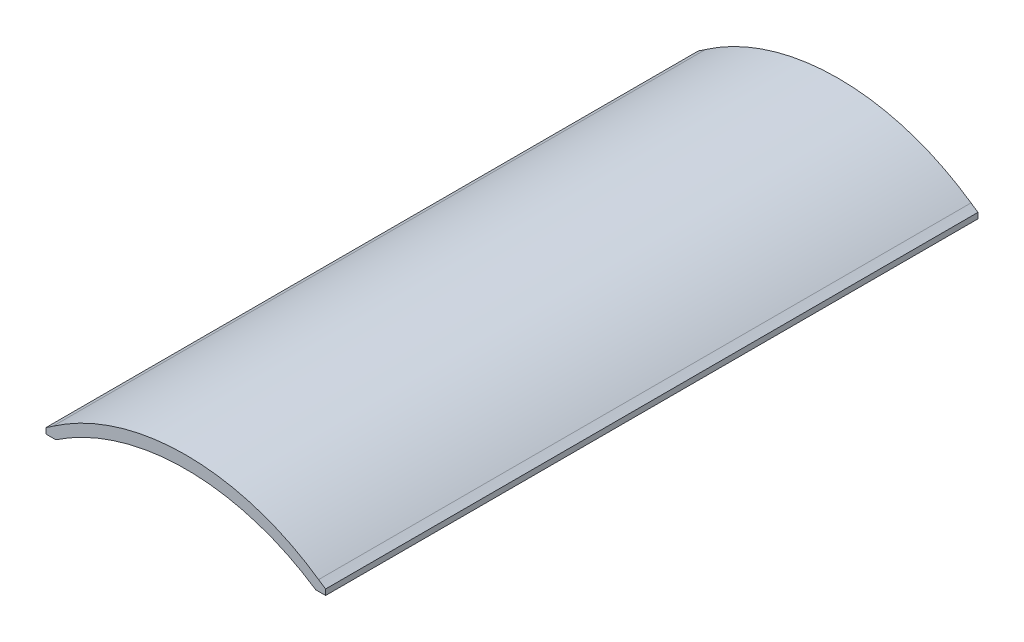
ISO-10303-21;
HEADER;
FILE_DESCRIPTION(('STEP AP214'),'2;1');
FILE_NAME('part.step','',(''),(''),'','','');
FILE_SCHEMA(('AUTOMOTIVE_DESIGN { 1 0 10303 214 1 1 1 1 }'));
ENDSEC;
DATA;
#1=APPLICATION_CONTEXT('core data for automotive mechanical design processes');
#2=APPLICATION_PROTOCOL_DEFINITION('international standard','automotive_design',2000,#1);
#3=PRODUCT_CONTEXT('',#1,'mechanical');
#4=PRODUCT('Part','Part','',(#3));
#5=PRODUCT_RELATED_PRODUCT_CATEGORY('part','',(#4));
#6=PRODUCT_DEFINITION_FORMATION('','',#4);
#7=PRODUCT_DEFINITION_CONTEXT('part definition',#1,'design');
#8=PRODUCT_DEFINITION('design','',#6,#7);
#9=PRODUCT_DEFINITION_SHAPE('','',#8);
#10=(LENGTH_UNIT() NAMED_UNIT(*) SI_UNIT(.MILLI.,.METRE.));
#11=(NAMED_UNIT(*) PLANE_ANGLE_UNIT() SI_UNIT($,.RADIAN.));
#12=(NAMED_UNIT(*) SI_UNIT($,.STERADIAN.) SOLID_ANGLE_UNIT());
#13=UNCERTAINTY_MEASURE_WITH_UNIT(LENGTH_MEASURE(1.E-05),#10,'distance_accuracy_value','');
#14=(GEOMETRIC_REPRESENTATION_CONTEXT(3) GLOBAL_UNCERTAINTY_ASSIGNED_CONTEXT((#13)) GLOBAL_UNIT_ASSIGNED_CONTEXT((#10,
#11,#12)) REPRESENTATION_CONTEXT('',''));
#15=CARTESIAN_POINT('',(0.,0.,0.));
#16=DIRECTION('',(0.,0.,1.));
#17=DIRECTION('',(1.,0.,0.));
#18=AXIS2_PLACEMENT_3D('',#15,#16,#17);
#19=CARTESIAN_POINT('',(-60.,-58.8562422233853,397.702232430035));
#20=DIRECTION('',(-1.,0.,0.));
#21=DIRECTION('',(0.,0.,1.));
#22=AXIS2_PLACEMENT_3D('',#19,#20,#21);
#23=PLANE('',#22);
#24=DIRECTION('',(0.,1.,0.));
#25=VECTOR('',#24,1.);
#26=CARTESIAN_POINT('',(-60.,-58.8562422233853,117.702232430035));
#27=LINE('',#26,#25);
#28=CARTESIAN_POINT('',(-60.,36.5857157145715,117.702232430035));
#29=VERTEX_POINT('',#28);
#30=CARTESIAN_POINT('',(-60.,39.0179513615472,117.702232430035));
#31=VERTEX_POINT('',#30);
#32=EDGE_CURVE('E316',#29,#31,#27,.T.);
#33=ORIENTED_EDGE('',*,*,#32,.F.);
#34=DIRECTION('',(0.,0.,1.));
#35=VECTOR('',#34,1.);
#36=CARTESIAN_POINT('',(-60.,36.5857157145715,397.702232430035));
#37=LINE('',#36,#35);
#38=CARTESIAN_POINT('',(-60.,36.5857157145715,397.702232430035));
#39=VERTEX_POINT('',#38);
#40=EDGE_CURVE('E303',#29,#39,#37,.T.);
#41=ORIENTED_EDGE('',*,*,#40,.T.);
#42=DIRECTION('',(0.,1.,0.));
#43=VECTOR('',#42,1.);
#44=CARTESIAN_POINT('',(-60.,-58.8562422233853,397.702232430035));
#45=LINE('',#44,#43);
#46=CARTESIAN_POINT('',(-60.,39.0179513615472,397.702232430035));
#47=VERTEX_POINT('',#46);
#48=EDGE_CURVE('E323',#39,#47,#45,.T.);
#49=ORIENTED_EDGE('',*,*,#48,.T.);
#50=DIRECTION('',(0.,0.,-1.));
#51=VECTOR('',#50,1.);
#52=CARTESIAN_POINT('',(-60.,39.0179513615472,528.098003271384));
#53=LINE('',#52,#51);
#54=EDGE_CURVE('E399',#47,#31,#53,.T.);
#55=ORIENTED_EDGE('',*,*,#54,.T.);
#56=EDGE_LOOP('',(#33,#41,#49,#55));
#57=FACE_BOUND('',#56,.T.);
#58=ADVANCED_FACE('F241',(#57),#23,.T.);
#59=CARTESIAN_POINT('',(-60.,-58.8562422233853,397.702232430035));
#60=DIRECTION('',(0.,0.,1.));
#61=DIRECTION('',(1.,0.,0.));
#62=AXIS2_PLACEMENT_3D('',#59,#60,#61);
#63=PLANE('',#62);
#64=ORIENTED_EDGE('',*,*,#48,.F.);
#65=DIRECTION('',(1.,0.,0.));
#66=VECTOR('',#65,1.);
#67=CARTESIAN_POINT('',(-60.000025,36.5857157145714,397.702232430035));
#68=LINE('',#67,#66);
#69=CARTESIAN_POINT('',(-55.7763390695374,36.5857157145714,397.702232430035));
#70=VERTEX_POINT('',#69);
#71=EDGE_CURVE('E318',#39,#70,#68,.T.);
#72=ORIENTED_EDGE('',*,*,#71,.T.);
#73=CARTESIAN_POINT('',(0.,-46.4142842854286,397.702232430035));
#74=DIRECTION('',(0.,0.,1.));
#75=DIRECTION('',(1.,0.,0.));
#76=AXIS2_PLACEMENT_3D('',#73,#74,#75);
#77=CIRCLE('',#76,100.);
#78=CARTESIAN_POINT('',(55.7763390695374,36.5857157145714,397.702232430035));
#79=VERTEX_POINT('',#78);
#80=EDGE_CURVE('E348',#79,#70,#77,.T.);
#81=ORIENTED_EDGE('',*,*,#80,.F.);
#82=CARTESIAN_POINT('',(60.,36.5857157145714,397.702232430035));
#83=VERTEX_POINT('',#82);
#84=EDGE_CURVE('E261',#79,#83,#68,.T.);
#85=ORIENTED_EDGE('',*,*,#84,.T.);
#86=DIRECTION('',(0.,1.,0.));
#87=VECTOR('',#86,1.);
#88=CARTESIAN_POINT('',(60.,-58.8562422233853,397.702232430035));
#89=LINE('',#88,#87);
#90=CARTESIAN_POINT('',(60.,39.0179513615473,397.702232430035));
#91=VERTEX_POINT('',#90);
#92=EDGE_CURVE('E312',#83,#91,#89,.T.);
#93=ORIENTED_EDGE('',*,*,#92,.T.);
#94=CARTESIAN_POINT('',(114.01348795448,123.17579781089,397.702232430035));
#95=DIRECTION('',(0.,0.,1.));
#96=DIRECTION('',(1.,0.,0.));
#97=AXIS2_PLACEMENT_3D('',#94,#95,#96);
#98=CIRCLE('',#97,100.);
#99=CARTESIAN_POINT('',(57.0067439772401,41.0160075171378,397.702232430035));
#100=VERTEX_POINT('',#99);
#101=EDGE_CURVE('E343',#91,#100,#98,.F.);
#102=ORIENTED_EDGE('',*,*,#101,.T.);
#103=CARTESIAN_POINT('',(0.,-41.1437827766148,397.702232430035));
#104=DIRECTION('',(0.,0.,1.));
#105=DIRECTION('',(1.,0.,0.));
#106=AXIS2_PLACEMENT_3D('',#103,#104,#105);
#107=CIRCLE('',#106,100.);
#108=CARTESIAN_POINT('',(-57.0067439772401,41.0160075171378,397.702232430035));
#109=VERTEX_POINT('',#108);
#110=EDGE_CURVE('E345',#100,#109,#107,.T.);
#111=ORIENTED_EDGE('',*,*,#110,.T.);
#112=CARTESIAN_POINT('',(-114.01348795448,123.17579781089,397.702232430035));
#113=DIRECTION('',(0.,0.,1.));
#114=DIRECTION('',(1.,0.,0.));
#115=AXIS2_PLACEMENT_3D('',#112,#113,#114);
#116=CIRCLE('',#115,100.);
#117=EDGE_CURVE('E418',#109,#47,#116,.F.);
#118=ORIENTED_EDGE('',*,*,#117,.T.);
#119=EDGE_LOOP('',(#64,#72,#81,#85,#93,#102,#111,#118));
#120=FACE_BOUND('',#119,.T.);
#121=ADVANCED_FACE('F419',(#120),#63,.T.);
#122=CARTESIAN_POINT('',(-114.01348795448,123.17579781089,528.098003271384));
#123=DIRECTION('',(0.,0.,-1.));
#124=DIRECTION('',(-1.,0.,0.));
#125=AXIS2_PLACEMENT_3D('',#122,#123,#124);
#126=CYLINDRICAL_SURFACE('',#125,100.);
#127=ORIENTED_EDGE('',*,*,#117,.F.);
#128=CARTESIAN_POINT('',(-57.0067439772401,41.0160075171378,117.702232430035));
#129=DIRECTION('',(0.,0.,1.));
#130=VECTOR('',#129,1.);
#131=LINE('',#128,#130);
#132=CARTESIAN_POINT('',(-57.0067439772401,41.0160075171378,117.702232430035));
#133=VERTEX_POINT('',#132);
#134=EDGE_CURVE('E403',#133,#109,#131,.T.);
#135=ORIENTED_EDGE('',*,*,#134,.F.);
#136=CARTESIAN_POINT('',(-114.01348795448,123.17579781089,117.702232430035));
#137=DIRECTION('',(0.,0.,-1.));
#138=DIRECTION('',(-1.,0.,0.));
#139=AXIS2_PLACEMENT_3D('',#136,#137,#138);
#140=CIRCLE('',#139,100.);
#141=EDGE_CURVE('E329',#31,#133,#140,.F.);
#142=ORIENTED_EDGE('',*,*,#141,.F.);
#143=ORIENTED_EDGE('',*,*,#54,.F.);
#144=EDGE_LOOP('',(#127,#135,#142,#143));
#145=FACE_BOUND('',#144,.T.);
#146=ADVANCED_FACE('F250',(#145),#126,.F.);
#147=CARTESIAN_POINT('',(114.01348795448,123.17579781089,-52.2977675699653));
#148=DIRECTION('',(0.,0.,1.));
#149=DIRECTION('',(1.,0.,0.));
#150=AXIS2_PLACEMENT_3D('',#147,#148,#149);
#151=CYLINDRICAL_SURFACE('',#150,100.);
#152=ORIENTED_EDGE('',*,*,#101,.F.);
#153=DIRECTION('',(0.,0.,1.));
#154=VECTOR('',#153,1.);
#155=CARTESIAN_POINT('',(60.,39.0179513615473,-52.2977675699653));
#156=LINE('',#155,#154);
#157=CARTESIAN_POINT('',(60.,39.0179513615473,117.702232430035));
#158=VERTEX_POINT('',#157);
#159=EDGE_CURVE('E404',#158,#91,#156,.T.);
#160=ORIENTED_EDGE('',*,*,#159,.F.);
#161=CARTESIAN_POINT('',(114.01348795448,123.17579781089,117.702232430035));
#162=DIRECTION('',(0.,0.,-1.));
#163=DIRECTION('',(-1.,0.,0.));
#164=AXIS2_PLACEMENT_3D('',#161,#162,#163);
#165=CIRCLE('',#164,100.);
#166=CARTESIAN_POINT('',(57.0067439772401,41.0160075171378,117.702232430035));
#167=VERTEX_POINT('',#166);
#168=EDGE_CURVE('E320',#167,#158,#165,.F.);
#169=ORIENTED_EDGE('',*,*,#168,.F.);
#170=CARTESIAN_POINT('',(57.0067439772401,41.0160075171378,397.702232430035));
#171=DIRECTION('',(0.,0.,-1.));
#172=VECTOR('',#171,1.);
#173=LINE('',#170,#172);
#174=EDGE_CURVE('E393',#100,#167,#173,.T.);
#175=ORIENTED_EDGE('',*,*,#174,.F.);
#176=EDGE_LOOP('',(#152,#160,#169,#175));
#177=FACE_BOUND('',#176,.T.);
#178=ADVANCED_FACE('F369',(#177),#151,.F.);
#179=CARTESIAN_POINT('',(0.,-41.1437827766148,475.));
#180=DIRECTION('',(0.,0.,-1.));
#181=DIRECTION('',(-1.,0.,0.));
#182=AXIS2_PLACEMENT_3D('',#179,#180,#181);
#183=CYLINDRICAL_SURFACE('',#182,100.);
#184=ORIENTED_EDGE('',*,*,#110,.F.);
#185=ORIENTED_EDGE('',*,*,#174,.T.);
#186=CARTESIAN_POINT('',(0.,-41.1437827766148,117.702232430035));
#187=DIRECTION('',(0.,0.,-1.));
#188=DIRECTION('',(-1.,0.,0.));
#189=AXIS2_PLACEMENT_3D('',#186,#187,#188);
#190=CIRCLE('',#189,100.);
#191=EDGE_CURVE('E335',#133,#167,#190,.T.);
#192=ORIENTED_EDGE('',*,*,#191,.F.);
#193=ORIENTED_EDGE('',*,*,#134,.T.);
#194=EDGE_LOOP('',(#184,#185,#192,#193));
#195=FACE_BOUND('',#194,.T.);
#196=ADVANCED_FACE('F361',(#195),#183,.T.);
#197=CARTESIAN_POINT('',(-60.,-58.8562422233853,117.702232430035));
#198=DIRECTION('',(0.,0.,-1.));
#199=DIRECTION('',(-1.,0.,0.));
#200=AXIS2_PLACEMENT_3D('',#197,#198,#199);
#201=PLANE('',#200);
#202=DIRECTION('',(1.,0.,0.));
#203=VECTOR('',#202,1.);
#204=CARTESIAN_POINT('',(-60.000025,36.5857157145715,117.702232430035));
#205=LINE('',#204,#203);
#206=CARTESIAN_POINT('',(-55.7763390695374,36.5857157145714,117.702232430035));
#207=VERTEX_POINT('',#206);
#208=EDGE_CURVE('E305',#29,#207,#205,.T.);
#209=ORIENTED_EDGE('',*,*,#208,.F.);
#210=ORIENTED_EDGE('',*,*,#32,.T.);
#211=ORIENTED_EDGE('',*,*,#141,.T.);
#212=ORIENTED_EDGE('',*,*,#191,.T.);
#213=ORIENTED_EDGE('',*,*,#168,.T.);
#214=DIRECTION('',(0.,1.,0.));
#215=VECTOR('',#214,1.);
#216=CARTESIAN_POINT('',(60.,-58.8562422233853,117.702232430035));
#217=LINE('',#216,#215);
#218=CARTESIAN_POINT('',(60.,36.5857157145715,117.702232430035));
#219=VERTEX_POINT('',#218);
#220=EDGE_CURVE('E249',#219,#158,#217,.T.);
#221=ORIENTED_EDGE('',*,*,#220,.F.);
#222=CARTESIAN_POINT('',(55.7763390695374,36.5857157145714,117.702232430035));
#223=VERTEX_POINT('',#222);
#224=EDGE_CURVE('E291',#223,#219,#205,.T.);
#225=ORIENTED_EDGE('',*,*,#224,.F.);
#226=CARTESIAN_POINT('',(0.,-46.4142842854286,117.702232430035));
#227=DIRECTION('',(0.,0.,-1.));
#228=DIRECTION('',(-1.,0.,0.));
#229=AXIS2_PLACEMENT_3D('',#226,#227,#228);
#230=CIRCLE('',#229,100.);
#231=EDGE_CURVE('E337',#207,#223,#230,.T.);
#232=ORIENTED_EDGE('',*,*,#231,.F.);
#233=EDGE_LOOP('',(#209,#210,#211,#212,#213,#221,#225,#232));
#234=FACE_BOUND('',#233,.T.);
#235=ADVANCED_FACE('F311',(#234),#201,.T.);
#236=CARTESIAN_POINT('',(60.,-58.8562422233853,397.702232430035));
#237=DIRECTION('',(1.,0.,0.));
#238=DIRECTION('',(0.,0.,-1.));
#239=AXIS2_PLACEMENT_3D('',#236,#237,#238);
#240=PLANE('',#239);
#241=DIRECTION('',(0.,0.,1.));
#242=VECTOR('',#241,1.);
#243=CARTESIAN_POINT('',(60.,36.5857157145714,397.702232430035));
#244=LINE('',#243,#242);
#245=EDGE_CURVE('E296',#219,#83,#244,.T.);
#246=ORIENTED_EDGE('',*,*,#245,.F.);
#247=ORIENTED_EDGE('',*,*,#220,.T.);
#248=ORIENTED_EDGE('',*,*,#159,.T.);
#249=ORIENTED_EDGE('',*,*,#92,.F.);
#250=EDGE_LOOP('',(#246,#247,#248,#249));
#251=FACE_BOUND('',#250,.T.);
#252=ADVANCED_FACE('F307',(#251),#240,.T.);
#253=CARTESIAN_POINT('',(0.,-46.4142842854286,478.));
#254=DIRECTION('',(0.,0.,-1.));
#255=DIRECTION('',(-1.,0.,0.));
#256=AXIS2_PLACEMENT_3D('',#253,#254,#255);
#257=CYLINDRICAL_SURFACE('',#256,100.);
#258=DIRECTION('',(0.,0.,-1.));
#259=VECTOR('',#258,1.);
#260=CARTESIAN_POINT('',(55.7763390695374,36.5857157145714,478.));
#261=LINE('',#260,#259);
#262=EDGE_CURVE('E13',#79,#223,#261,.T.);
#263=ORIENTED_EDGE('',*,*,#262,.F.);
#264=ORIENTED_EDGE('',*,*,#80,.T.);
#265=DIRECTION('',(0.,0.,-1.));
#266=VECTOR('',#265,1.);
#267=CARTESIAN_POINT('',(-55.7763390695374,36.5857157145714,478.));
#268=LINE('',#267,#266);
#269=EDGE_CURVE('E257',#207,#70,#268,.F.);
#270=ORIENTED_EDGE('',*,*,#269,.F.);
#271=ORIENTED_EDGE('',*,*,#231,.T.);
#272=EDGE_LOOP('',(#263,#264,#270,#271));
#273=FACE_BOUND('',#272,.T.);
#274=ADVANCED_FACE('F372',(#273),#257,.F.);
#275=CARTESIAN_POINT('',(-60.000025,36.5857157145715,117.702232430035));
#276=DIRECTION('',(0.,1.,0.));
#277=DIRECTION('',(0.,0.,1.));
#278=AXIS2_PLACEMENT_3D('',#275,#276,#277);
#279=PLANE('',#278);
#280=ORIENTED_EDGE('',*,*,#269,.T.);
#281=ORIENTED_EDGE('',*,*,#71,.F.);
#282=ORIENTED_EDGE('',*,*,#40,.F.);
#283=ORIENTED_EDGE('',*,*,#208,.T.);
#284=EDGE_LOOP('',(#280,#281,#282,#283));
#285=FACE_BOUND('',#284,.T.);
#286=ADVANCED_FACE('F437',(#285),#279,.F.);
#287=ORIENTED_EDGE('',*,*,#262,.T.);
#288=ORIENTED_EDGE('',*,*,#224,.T.);
#289=ORIENTED_EDGE('',*,*,#245,.T.);
#290=ORIENTED_EDGE('',*,*,#84,.F.);
#291=EDGE_LOOP('',(#287,#288,#289,#290));
#292=FACE_BOUND('',#291,.T.);
#293=ADVANCED_FACE('F292',(#292),#279,.F.);
#294=CLOSED_SHELL('',(#58,#121,#146,#178,#196,#235,#252,#274,#286,#293));
#295=MANIFOLD_SOLID_BREP('B2',#294);
#296=ADVANCED_BREP_SHAPE_REPRESENTATION('',(#18,#295),#14);
#297=SHAPE_DEFINITION_REPRESENTATION(#9,#296);
ENDSEC;
END-ISO-10303-21;
